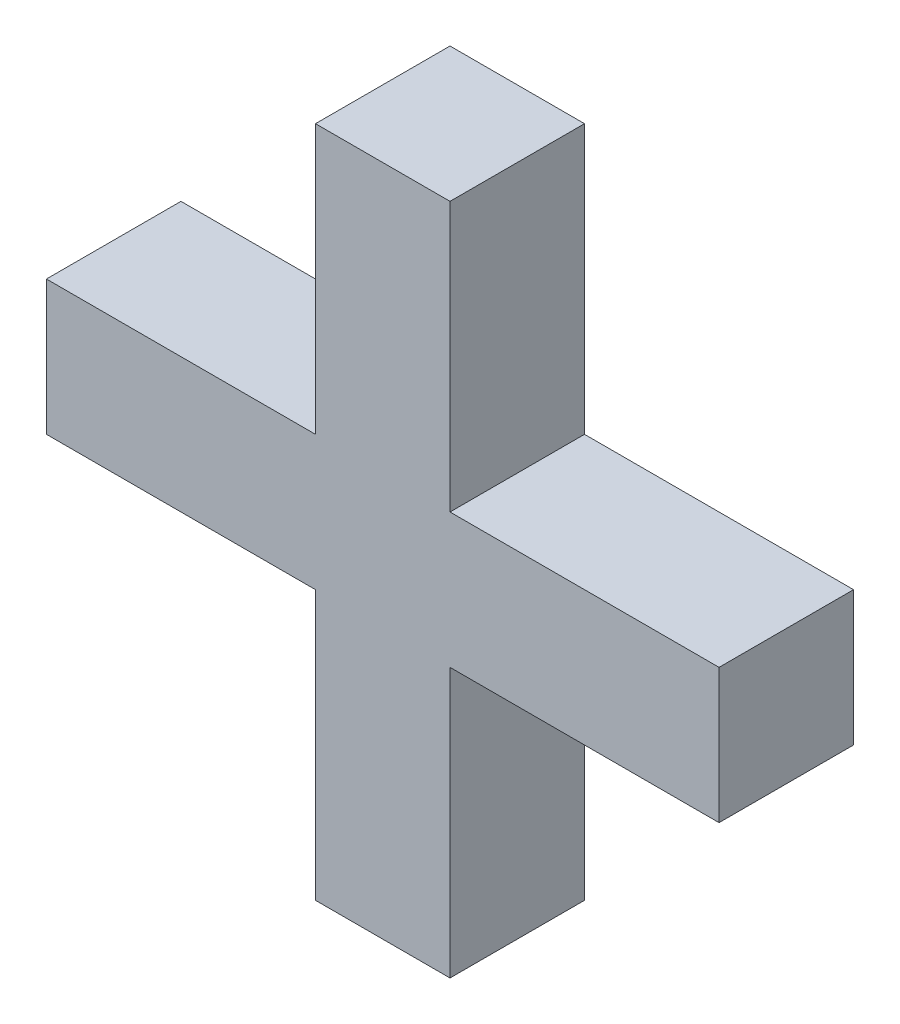
ISO-10303-21;
HEADER;
FILE_DESCRIPTION(('STEP AP214'),'2;1');
FILE_NAME('part.step','',(''),(''),'','','');
FILE_SCHEMA(('AUTOMOTIVE_DESIGN { 1 0 10303 214 1 1 1 1 }'));
ENDSEC;
DATA;
#1=APPLICATION_CONTEXT('core data for automotive mechanical design processes');
#2=APPLICATION_PROTOCOL_DEFINITION('international standard','automotive_design',2000,#1);
#3=PRODUCT_CONTEXT('',#1,'mechanical');
#4=PRODUCT('Part','Part','',(#3));
#5=PRODUCT_RELATED_PRODUCT_CATEGORY('part','',(#4));
#6=PRODUCT_DEFINITION_FORMATION('','',#4);
#7=PRODUCT_DEFINITION_CONTEXT('part definition',#1,'design');
#8=PRODUCT_DEFINITION('design','',#6,#7);
#9=PRODUCT_DEFINITION_SHAPE('','',#8);
#10=(LENGTH_UNIT() NAMED_UNIT(*) SI_UNIT(.MILLI.,.METRE.));
#11=(NAMED_UNIT(*) PLANE_ANGLE_UNIT() SI_UNIT($,.RADIAN.));
#12=(NAMED_UNIT(*) SI_UNIT($,.STERADIAN.) SOLID_ANGLE_UNIT());
#13=UNCERTAINTY_MEASURE_WITH_UNIT(LENGTH_MEASURE(1.E-05),#10,'distance_accuracy_value','');
#14=(GEOMETRIC_REPRESENTATION_CONTEXT(3) GLOBAL_UNCERTAINTY_ASSIGNED_CONTEXT((#13)) GLOBAL_UNIT_ASSIGNED_CONTEXT((#10,
#11,#12)) REPRESENTATION_CONTEXT('',''));
#15=CARTESIAN_POINT('',(0.,0.,0.));
#16=DIRECTION('',(0.,0.,1.));
#17=DIRECTION('',(1.,0.,0.));
#18=AXIS2_PLACEMENT_3D('',#15,#16,#17);
#19=CARTESIAN_POINT('',(3.,-3.,0.));
#20=DIRECTION('',(0.,1.,0.));
#21=DIRECTION('',(-1.,0.,0.));
#22=AXIS2_PLACEMENT_3D('',#19,#20,#21);
#23=PLANE('',#22);
#24=DIRECTION('',(-1.,0.,0.));
#25=VECTOR('',#24,1.);
#26=CARTESIAN_POINT('',(3.,-3.,0.));
#27=LINE('',#26,#25);
#28=CARTESIAN_POINT('',(0.,-3.,0.));
#29=VERTEX_POINT('',#28);
#30=CARTESIAN_POINT('',(-2.,-3.,0.));
#31=VERTEX_POINT('',#30);
#32=EDGE_CURVE('E169',#29,#31,#27,.T.);
#33=ORIENTED_EDGE('',*,*,#32,.F.);
#34=DIRECTION('',(0.,0.,1.));
#35=VECTOR('',#34,1.);
#36=CARTESIAN_POINT('',(0.,-3.,1.));
#37=LINE('',#36,#35);
#38=CARTESIAN_POINT('',(0.,-3.,1.));
#39=VERTEX_POINT('',#38);
#40=EDGE_CURVE('E177',#29,#39,#37,.T.);
#41=ORIENTED_EDGE('',*,*,#40,.T.);
#42=DIRECTION('',(-1.,0.,0.));
#43=VECTOR('',#42,1.);
#44=CARTESIAN_POINT('',(3.,-3.,1.));
#45=LINE('',#44,#43);
#46=CARTESIAN_POINT('',(-2.,-3.,1.));
#47=VERTEX_POINT('',#46);
#48=EDGE_CURVE('E165',#39,#47,#45,.T.);
#49=ORIENTED_EDGE('',*,*,#48,.T.);
#50=DIRECTION('',(0.,0.,-1.));
#51=VECTOR('',#50,1.);
#52=CARTESIAN_POINT('',(-2.,-3.,0.));
#53=LINE('',#52,#51);
#54=EDGE_CURVE('E148',#47,#31,#53,.T.);
#55=ORIENTED_EDGE('',*,*,#54,.T.);
#56=EDGE_LOOP('',(#33,#41,#49,#55));
#57=FACE_BOUND('',#56,.T.);
#58=ADVANCED_FACE('F37',(#57),#23,.F.);
#59=CARTESIAN_POINT('',(3.,-2.,0.));
#60=DIRECTION('',(0.,1.,0.));
#61=DIRECTION('',(-1.,0.,0.));
#62=AXIS2_PLACEMENT_3D('',#59,#60,#61);
#63=PLANE('',#62);
#64=DIRECTION('',(0.,0.,1.));
#65=VECTOR('',#64,1.);
#66=CARTESIAN_POINT('',(0.,-2.,1.));
#67=LINE('',#66,#65);
#68=CARTESIAN_POINT('',(0.,-2.,0.));
#69=VERTEX_POINT('',#68);
#70=CARTESIAN_POINT('',(0.,-2.,1.));
#71=VERTEX_POINT('',#70);
#72=EDGE_CURVE('E173',#69,#71,#67,.T.);
#73=ORIENTED_EDGE('',*,*,#72,.F.);
#74=DIRECTION('',(-1.,0.,0.));
#75=VECTOR('',#74,1.);
#76=CARTESIAN_POINT('',(3.,-2.,0.));
#77=LINE('',#76,#75);
#78=CARTESIAN_POINT('',(-2.,-2.,0.));
#79=VERTEX_POINT('',#78);
#80=EDGE_CURVE('E140',#69,#79,#77,.T.);
#81=ORIENTED_EDGE('',*,*,#80,.T.);
#82=DIRECTION('',(0.,0.,-1.));
#83=VECTOR('',#82,1.);
#84=CARTESIAN_POINT('',(-2.,-2.,0.));
#85=LINE('',#84,#83);
#86=CARTESIAN_POINT('',(-2.,-2.,1.));
#87=VERTEX_POINT('',#86);
#88=EDGE_CURVE('E137',#87,#79,#85,.T.);
#89=ORIENTED_EDGE('',*,*,#88,.F.);
#90=DIRECTION('',(-1.,0.,0.));
#91=VECTOR('',#90,1.);
#92=CARTESIAN_POINT('',(3.,-2.,1.));
#93=LINE('',#92,#91);
#94=EDGE_CURVE('E52',#71,#87,#93,.T.);
#95=ORIENTED_EDGE('',*,*,#94,.F.);
#96=EDGE_LOOP('',(#73,#81,#89,#95));
#97=FACE_BOUND('',#96,.T.);
#98=ADVANCED_FACE('F138',(#97),#63,.T.);
#99=CARTESIAN_POINT('',(-2.,0.,0.));
#100=DIRECTION('',(-1.,0.,0.));
#101=DIRECTION('',(0.,-1.,0.));
#102=AXIS2_PLACEMENT_3D('',#99,#100,#101);
#103=PLANE('',#102);
#104=DIRECTION('',(0.,1.,0.));
#105=VECTOR('',#104,1.);
#106=CARTESIAN_POINT('',(-2.,0.,1.));
#107=LINE('',#106,#105);
#108=EDGE_CURVE('E129',#47,#87,#107,.T.);
#109=ORIENTED_EDGE('',*,*,#108,.T.);
#110=ORIENTED_EDGE('',*,*,#88,.T.);
#111=DIRECTION('',(0.,-1.,0.));
#112=VECTOR('',#111,1.);
#113=CARTESIAN_POINT('',(-2.,0.,0.));
#114=LINE('',#113,#112);
#115=EDGE_CURVE('E144',#79,#31,#114,.T.);
#116=ORIENTED_EDGE('',*,*,#115,.T.);
#117=ORIENTED_EDGE('',*,*,#54,.F.);
#118=EDGE_LOOP('',(#109,#110,#116,#117));
#119=FACE_BOUND('',#118,.T.);
#120=ADVANCED_FACE('F146',(#119),#103,.T.);
#121=CARTESIAN_POINT('',(0.,0.,1.));
#122=DIRECTION('',(1.,0.,0.));
#123=DIRECTION('',(0.,1.,0.));
#124=AXIS2_PLACEMENT_3D('',#121,#122,#123);
#125=PLANE('',#124);
#126=ORIENTED_EDGE('',*,*,#40,.F.);
#127=DIRECTION('',(0.,-1.,0.));
#128=VECTOR('',#127,1.);
#129=CARTESIAN_POINT('',(0.,0.,0.));
#130=LINE('',#129,#128);
#131=CARTESIAN_POINT('',(0.,-5.,0.));
#132=VERTEX_POINT('',#131);
#133=EDGE_CURVE('E179',#29,#132,#130,.T.);
#134=ORIENTED_EDGE('',*,*,#133,.T.);
#135=DIRECTION('',(0.,0.,-1.));
#136=VECTOR('',#135,1.);
#137=CARTESIAN_POINT('',(0.,-5.,1.));
#138=LINE('',#137,#136);
#139=CARTESIAN_POINT('',(0.,-5.,1.));
#140=VERTEX_POINT('',#139);
#141=EDGE_CURVE('E11',#140,#132,#138,.T.);
#142=ORIENTED_EDGE('',*,*,#141,.F.);
#143=DIRECTION('',(0.,-1.,0.));
#144=VECTOR('',#143,1.);
#145=CARTESIAN_POINT('',(0.,0.,1.));
#146=LINE('',#145,#144);
#147=EDGE_CURVE('E182',#39,#140,#146,.T.);
#148=ORIENTED_EDGE('',*,*,#147,.F.);
#149=EDGE_LOOP('',(#126,#134,#142,#148));
#150=FACE_BOUND('',#149,.T.);
#151=ADVANCED_FACE('F231',(#150),#125,.F.);
#152=CARTESIAN_POINT('',(1.,0.,1.));
#153=DIRECTION('',(-1.,0.,0.));
#154=DIRECTION('',(0.,-1.,0.));
#155=AXIS2_PLACEMENT_3D('',#152,#153,#154);
#156=PLANE('',#155);
#157=DIRECTION('',(0.,0.,-1.));
#158=VECTOR('',#157,1.);
#159=CARTESIAN_POINT('',(1.,-3.,1.));
#160=LINE('',#159,#158);
#161=CARTESIAN_POINT('',(1.,-3.,1.));
#162=VERTEX_POINT('',#161);
#163=CARTESIAN_POINT('',(1.,-3.,0.));
#164=VERTEX_POINT('',#163);
#165=EDGE_CURVE('E175',#162,#164,#160,.T.);
#166=ORIENTED_EDGE('',*,*,#165,.F.);
#167=DIRECTION('',(0.,1.,0.));
#168=VECTOR('',#167,1.);
#169=CARTESIAN_POINT('',(1.,0.,1.));
#170=LINE('',#169,#168);
#171=CARTESIAN_POINT('',(1.,-5.,1.));
#172=VERTEX_POINT('',#171);
#173=EDGE_CURVE('E185',#172,#162,#170,.T.);
#174=ORIENTED_EDGE('',*,*,#173,.F.);
#175=DIRECTION('',(0.,0.,-1.));
#176=VECTOR('',#175,1.);
#177=CARTESIAN_POINT('',(1.,-5.,1.));
#178=LINE('',#177,#176);
#179=CARTESIAN_POINT('',(1.,-5.,0.));
#180=VERTEX_POINT('',#179);
#181=EDGE_CURVE('E45',#172,#180,#178,.T.);
#182=ORIENTED_EDGE('',*,*,#181,.T.);
#183=DIRECTION('',(0.,1.,0.));
#184=VECTOR('',#183,1.);
#185=CARTESIAN_POINT('',(1.,0.,0.));
#186=LINE('',#185,#184);
#187=EDGE_CURVE('E197',#180,#164,#186,.T.);
#188=ORIENTED_EDGE('',*,*,#187,.T.);
#189=EDGE_LOOP('',(#166,#174,#182,#188));
#190=FACE_BOUND('',#189,.T.);
#191=ADVANCED_FACE('F212',(#190),#156,.F.);
#192=CARTESIAN_POINT('',(0.,0.,0.));
#193=VERTEX_POINT('',#192);
#194=EDGE_CURVE('E191',#193,#69,#130,.T.);
#195=ORIENTED_EDGE('',*,*,#194,.T.);
#196=ORIENTED_EDGE('',*,*,#72,.T.);
#197=CARTESIAN_POINT('',(0.,0.,1.));
#198=VERTEX_POINT('',#197);
#199=EDGE_CURVE('E132',#198,#71,#146,.T.);
#200=ORIENTED_EDGE('',*,*,#199,.F.);
#201=DIRECTION('',(0.,0.,-1.));
#202=VECTOR('',#201,1.);
#203=CARTESIAN_POINT('',(0.,0.,1.));
#204=LINE('',#203,#202);
#205=EDGE_CURVE('E190',#198,#193,#204,.T.);
#206=ORIENTED_EDGE('',*,*,#205,.T.);
#207=EDGE_LOOP('',(#195,#196,#200,#206));
#208=FACE_BOUND('',#207,.T.);
#209=ADVANCED_FACE('F39',(#208),#125,.F.);
#210=CARTESIAN_POINT('',(0.,-5.,1.));
#211=DIRECTION('',(0.,1.,0.));
#212=DIRECTION('',(0.,0.,1.));
#213=AXIS2_PLACEMENT_3D('',#210,#211,#212);
#214=PLANE('',#213);
#215=DIRECTION('',(1.,0.,0.));
#216=VECTOR('',#215,1.);
#217=CARTESIAN_POINT('',(0.,-5.,0.));
#218=LINE('',#217,#216);
#219=EDGE_CURVE('E194',#132,#180,#218,.T.);
#220=ORIENTED_EDGE('',*,*,#219,.T.);
#221=ORIENTED_EDGE('',*,*,#181,.F.);
#222=DIRECTION('',(1.,0.,0.));
#223=VECTOR('',#222,1.);
#224=CARTESIAN_POINT('',(0.,-5.,1.));
#225=LINE('',#224,#223);
#226=EDGE_CURVE('E181',#140,#172,#225,.T.);
#227=ORIENTED_EDGE('',*,*,#226,.F.);
#228=ORIENTED_EDGE('',*,*,#141,.T.);
#229=EDGE_LOOP('',(#220,#221,#227,#228));
#230=FACE_BOUND('',#229,.T.);
#231=ADVANCED_FACE('F228',(#230),#214,.F.);
#232=CARTESIAN_POINT('',(1.,-2.,1.));
#233=VERTEX_POINT('',#232);
#234=CARTESIAN_POINT('',(1.,0.,1.));
#235=VERTEX_POINT('',#234);
#236=EDGE_CURVE('E184',#233,#235,#170,.T.);
#237=ORIENTED_EDGE('',*,*,#236,.F.);
#238=DIRECTION('',(0.,0.,-1.));
#239=VECTOR('',#238,1.);
#240=CARTESIAN_POINT('',(1.,-2.,1.));
#241=LINE('',#240,#239);
#242=CARTESIAN_POINT('',(1.,-2.,0.));
#243=VERTEX_POINT('',#242);
#244=EDGE_CURVE('E164',#233,#243,#241,.T.);
#245=ORIENTED_EDGE('',*,*,#244,.T.);
#246=CARTESIAN_POINT('',(1.,0.,0.));
#247=VERTEX_POINT('',#246);
#248=EDGE_CURVE('E196',#243,#247,#186,.T.);
#249=ORIENTED_EDGE('',*,*,#248,.T.);
#250=DIRECTION('',(0.,0.,-1.));
#251=VECTOR('',#250,1.);
#252=CARTESIAN_POINT('',(1.,0.,1.));
#253=LINE('',#252,#251);
#254=EDGE_CURVE('E204',#235,#247,#253,.T.);
#255=ORIENTED_EDGE('',*,*,#254,.F.);
#256=EDGE_LOOP('',(#237,#245,#249,#255));
#257=FACE_BOUND('',#256,.T.);
#258=ADVANCED_FACE('F259',(#257),#156,.F.);
#259=CARTESIAN_POINT('',(0.,0.,1.));
#260=DIRECTION('',(0.,-1.,0.));
#261=DIRECTION('',(0.,0.,-1.));
#262=AXIS2_PLACEMENT_3D('',#259,#260,#261);
#263=PLANE('',#262);
#264=DIRECTION('',(-1.,0.,0.));
#265=VECTOR('',#264,1.);
#266=CARTESIAN_POINT('',(0.,0.,0.));
#267=LINE('',#266,#265);
#268=EDGE_CURVE('E200',#247,#193,#267,.T.);
#269=ORIENTED_EDGE('',*,*,#268,.T.);
#270=ORIENTED_EDGE('',*,*,#205,.F.);
#271=DIRECTION('',(-1.,0.,0.));
#272=VECTOR('',#271,1.);
#273=CARTESIAN_POINT('',(0.,0.,1.));
#274=LINE('',#273,#272);
#275=EDGE_CURVE('E188',#235,#198,#274,.T.);
#276=ORIENTED_EDGE('',*,*,#275,.F.);
#277=ORIENTED_EDGE('',*,*,#254,.T.);
#278=EDGE_LOOP('',(#269,#270,#276,#277));
#279=FACE_BOUND('',#278,.T.);
#280=ADVANCED_FACE('F254',(#279),#263,.F.);
#281=CARTESIAN_POINT('',(0.,0.,1.));
#282=DIRECTION('',(0.,0.,1.));
#283=DIRECTION('',(1.,0.,0.));
#284=AXIS2_PLACEMENT_3D('',#281,#282,#283);
#285=PLANE('',#284);
#286=ORIENTED_EDGE('',*,*,#199,.T.);
#287=ORIENTED_EDGE('',*,*,#94,.T.);
#288=ORIENTED_EDGE('',*,*,#108,.F.);
#289=ORIENTED_EDGE('',*,*,#48,.F.);
#290=ORIENTED_EDGE('',*,*,#147,.T.);
#291=ORIENTED_EDGE('',*,*,#226,.T.);
#292=ORIENTED_EDGE('',*,*,#173,.T.);
#293=CARTESIAN_POINT('',(3.,-3.,1.));
#294=VERTEX_POINT('',#293);
#295=EDGE_CURVE('E162',#294,#162,#45,.T.);
#296=ORIENTED_EDGE('',*,*,#295,.F.);
#297=DIRECTION('',(0.,1.,0.));
#298=VECTOR('',#297,1.);
#299=CARTESIAN_POINT('',(3.,0.,1.));
#300=LINE('',#299,#298);
#301=CARTESIAN_POINT('',(3.,-2.,1.));
#302=VERTEX_POINT('',#301);
#303=EDGE_CURVE('E153',#294,#302,#300,.T.);
#304=ORIENTED_EDGE('',*,*,#303,.T.);
#305=EDGE_CURVE('E133',#302,#233,#93,.T.);
#306=ORIENTED_EDGE('',*,*,#305,.T.);
#307=ORIENTED_EDGE('',*,*,#236,.T.);
#308=ORIENTED_EDGE('',*,*,#275,.T.);
#309=EDGE_LOOP('',(#286,#287,#288,#289,#290,#291,#292,#296,#304,#306,#307,#308));
#310=FACE_BOUND('',#309,.T.);
#311=ADVANCED_FACE('F126',(#310),#285,.T.);
#312=CARTESIAN_POINT('',(0.,0.,0.));
#313=DIRECTION('',(0.,0.,1.));
#314=DIRECTION('',(1.,0.,0.));
#315=AXIS2_PLACEMENT_3D('',#312,#313,#314);
#316=PLANE('',#315);
#317=ORIENTED_EDGE('',*,*,#248,.F.);
#318=CARTESIAN_POINT('',(3.,-2.,0.));
#319=VERTEX_POINT('',#318);
#320=EDGE_CURVE('E60',#319,#243,#77,.T.);
#321=ORIENTED_EDGE('',*,*,#320,.F.);
#322=DIRECTION('',(0.,-1.,0.));
#323=VECTOR('',#322,1.);
#324=CARTESIAN_POINT('',(3.,0.,0.));
#325=LINE('',#324,#323);
#326=CARTESIAN_POINT('',(3.,-3.,0.));
#327=VERTEX_POINT('',#326);
#328=EDGE_CURVE('E158',#319,#327,#325,.T.);
#329=ORIENTED_EDGE('',*,*,#328,.T.);
#330=EDGE_CURVE('E166',#327,#164,#27,.T.);
#331=ORIENTED_EDGE('',*,*,#330,.T.);
#332=ORIENTED_EDGE('',*,*,#187,.F.);
#333=ORIENTED_EDGE('',*,*,#219,.F.);
#334=ORIENTED_EDGE('',*,*,#133,.F.);
#335=ORIENTED_EDGE('',*,*,#32,.T.);
#336=ORIENTED_EDGE('',*,*,#115,.F.);
#337=ORIENTED_EDGE('',*,*,#80,.F.);
#338=ORIENTED_EDGE('',*,*,#194,.F.);
#339=ORIENTED_EDGE('',*,*,#268,.F.);
#340=EDGE_LOOP('',(#317,#321,#329,#331,#332,#333,#334,#335,#336,#337,#338,#339));
#341=FACE_BOUND('',#340,.T.);
#342=ADVANCED_FACE('F218',(#341),#316,.F.);
#343=CARTESIAN_POINT('',(3.,0.,0.));
#344=DIRECTION('',(-1.,0.,0.));
#345=DIRECTION('',(0.,-1.,0.));
#346=AXIS2_PLACEMENT_3D('',#343,#344,#345);
#347=PLANE('',#346);
#348=ORIENTED_EDGE('',*,*,#303,.F.);
#349=DIRECTION('',(0.,0.,-1.));
#350=VECTOR('',#349,1.);
#351=CARTESIAN_POINT('',(3.,-3.,0.));
#352=LINE('',#351,#350);
#353=EDGE_CURVE('E134',#294,#327,#352,.T.);
#354=ORIENTED_EDGE('',*,*,#353,.T.);
#355=ORIENTED_EDGE('',*,*,#328,.F.);
#356=DIRECTION('',(0.,0.,-1.));
#357=VECTOR('',#356,1.);
#358=CARTESIAN_POINT('',(3.,-2.,0.));
#359=LINE('',#358,#357);
#360=EDGE_CURVE('E156',#302,#319,#359,.T.);
#361=ORIENTED_EDGE('',*,*,#360,.F.);
#362=EDGE_LOOP('',(#348,#354,#355,#361));
#363=FACE_BOUND('',#362,.T.);
#364=ADVANCED_FACE('F246',(#363),#347,.F.);
#365=ORIENTED_EDGE('',*,*,#244,.F.);
#366=ORIENTED_EDGE('',*,*,#305,.F.);
#367=ORIENTED_EDGE('',*,*,#360,.T.);
#368=ORIENTED_EDGE('',*,*,#320,.T.);
#369=EDGE_LOOP('',(#365,#366,#367,#368));
#370=FACE_BOUND('',#369,.T.);
#371=ADVANCED_FACE('F240',(#370),#63,.T.);
#372=ORIENTED_EDGE('',*,*,#295,.T.);
#373=ORIENTED_EDGE('',*,*,#165,.T.);
#374=ORIENTED_EDGE('',*,*,#330,.F.);
#375=ORIENTED_EDGE('',*,*,#353,.F.);
#376=EDGE_LOOP('',(#372,#373,#374,#375));
#377=FACE_BOUND('',#376,.T.);
#378=ADVANCED_FACE('F224',(#377),#23,.F.);
#379=CLOSED_SHELL('',(#58,#98,#120,#151,#191,#209,#231,#258,#280,#311,#342,#364,#371,#378));
#380=MANIFOLD_SOLID_BREP('B2',#379);
#381=ADVANCED_BREP_SHAPE_REPRESENTATION('',(#18,#380),#14);
#382=SHAPE_DEFINITION_REPRESENTATION(#9,#381);
ENDSEC;
END-ISO-10303-21;
